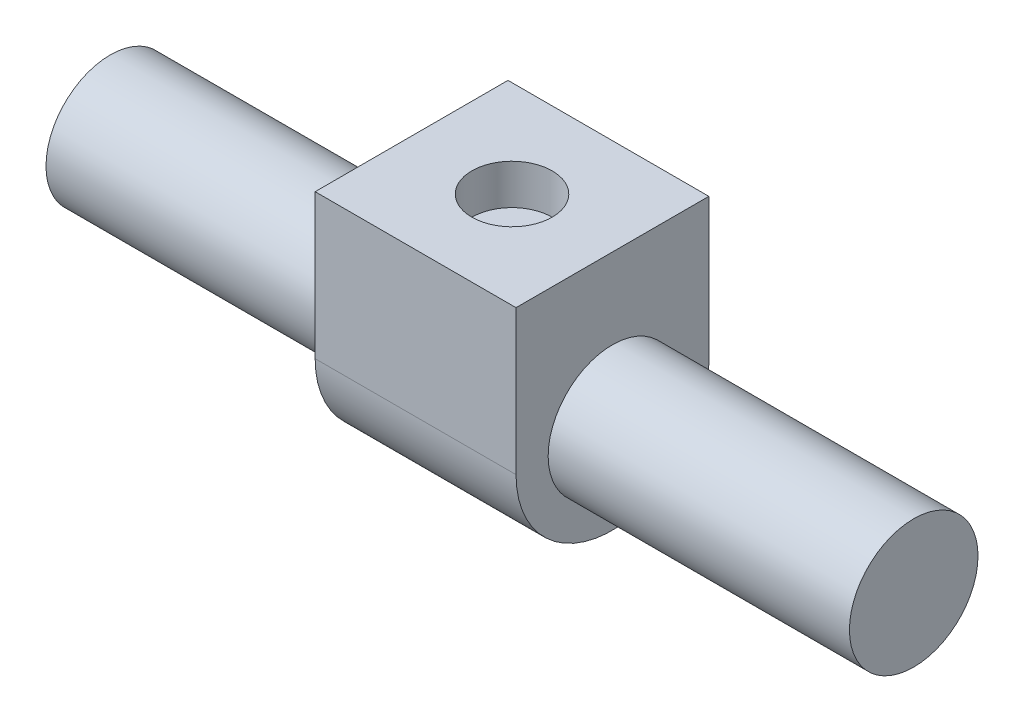
ISO-10303-21;
HEADER;
FILE_DESCRIPTION(('STEP AP214'),'2;1');
FILE_NAME('part.step','',(''),(''),'','','');
FILE_SCHEMA(('AUTOMOTIVE_DESIGN { 1 0 10303 214 1 1 1 1 }'));
ENDSEC;
DATA;
#1=APPLICATION_CONTEXT('core data for automotive mechanical design processes');
#2=APPLICATION_PROTOCOL_DEFINITION('international standard','automotive_design',2000,#1);
#3=PRODUCT_CONTEXT('',#1,'mechanical');
#4=PRODUCT('Part','Part','',(#3));
#5=PRODUCT_RELATED_PRODUCT_CATEGORY('part','',(#4));
#6=PRODUCT_DEFINITION_FORMATION('','',#4);
#7=PRODUCT_DEFINITION_CONTEXT('part definition',#1,'design');
#8=PRODUCT_DEFINITION('design','',#6,#7);
#9=PRODUCT_DEFINITION_SHAPE('','',#8);
#10=(LENGTH_UNIT() NAMED_UNIT(*) SI_UNIT(.MILLI.,.METRE.));
#11=(NAMED_UNIT(*) PLANE_ANGLE_UNIT() SI_UNIT($,.RADIAN.));
#12=(NAMED_UNIT(*) SI_UNIT($,.STERADIAN.) SOLID_ANGLE_UNIT());
#13=UNCERTAINTY_MEASURE_WITH_UNIT(LENGTH_MEASURE(1.E-05),#10,'distance_accuracy_value','');
#14=(GEOMETRIC_REPRESENTATION_CONTEXT(3) GLOBAL_UNCERTAINTY_ASSIGNED_CONTEXT((#13)) GLOBAL_UNIT_ASSIGNED_CONTEXT((#10,
#11,#12)) REPRESENTATION_CONTEXT('',''));
#15=CARTESIAN_POINT('',(0.,0.,0.));
#16=DIRECTION('',(0.,0.,1.));
#17=DIRECTION('',(1.,0.,0.));
#18=AXIS2_PLACEMENT_3D('',#15,#16,#17);
#19=CARTESIAN_POINT('',(12.5,0.,0.));
#20=DIRECTION('',(-1.,0.,0.));
#21=DIRECTION('',(0.,0.,1.));
#22=AXIS2_PLACEMENT_3D('',#19,#20,#21);
#23=CYLINDRICAL_SURFACE('',#22,12.);
#24=CARTESIAN_POINT('',(-12.5,0.,0.));
#25=DIRECTION('',(1.,0.,0.));
#26=DIRECTION('',(0.,0.,1.));
#27=AXIS2_PLACEMENT_3D('',#24,#25,#26);
#28=CIRCLE('',#27,12.);
#29=CARTESIAN_POINT('',(-12.5,0.,12.));
#30=VERTEX_POINT('',#29);
#31=CARTESIAN_POINT('',(-12.5,0.,-12.));
#32=VERTEX_POINT('',#31);
#33=EDGE_CURVE('E109',#30,#32,#28,.T.);
#34=ORIENTED_EDGE('',*,*,#33,.T.);
#35=DIRECTION('',(-1.,0.,0.));
#36=VECTOR('',#35,1.);
#37=CARTESIAN_POINT('',(12.5,0.,-12.));
#38=LINE('',#37,#36);
#39=CARTESIAN_POINT('',(12.5,0.,-12.));
#40=VERTEX_POINT('',#39);
#41=EDGE_CURVE('E50',#40,#32,#38,.T.);
#42=ORIENTED_EDGE('',*,*,#41,.F.);
#43=CARTESIAN_POINT('',(12.5,0.,0.));
#44=DIRECTION('',(1.,0.,0.));
#45=DIRECTION('',(0.,0.,1.));
#46=AXIS2_PLACEMENT_3D('',#43,#44,#45);
#47=CIRCLE('',#46,12.);
#48=CARTESIAN_POINT('',(12.5,0.,12.));
#49=VERTEX_POINT('',#48);
#50=EDGE_CURVE('E95',#49,#40,#47,.T.);
#51=ORIENTED_EDGE('',*,*,#50,.F.);
#52=DIRECTION('',(-1.,0.,0.));
#53=VECTOR('',#52,1.);
#54=CARTESIAN_POINT('',(12.5,0.,12.));
#55=LINE('',#54,#53);
#56=EDGE_CURVE('E105',#49,#30,#55,.T.);
#57=ORIENTED_EDGE('',*,*,#56,.T.);
#58=EDGE_LOOP('',(#34,#42,#51,#57));
#59=FACE_BOUND('',#58,.T.);
#60=ADVANCED_FACE('F41',(#59),#23,.T.);
#61=CARTESIAN_POINT('',(12.5,18.,-12.));
#62=DIRECTION('',(0.,0.,1.));
#63=DIRECTION('',(1.,0.,0.));
#64=AXIS2_PLACEMENT_3D('',#61,#62,#63);
#65=PLANE('',#64);
#66=DIRECTION('',(0.,1.,0.));
#67=VECTOR('',#66,1.);
#68=CARTESIAN_POINT('',(-12.5,18.,-12.));
#69=LINE('',#68,#67);
#70=CARTESIAN_POINT('',(-12.5,18.,-12.));
#71=VERTEX_POINT('',#70);
#72=EDGE_CURVE('E100',#32,#71,#69,.T.);
#73=ORIENTED_EDGE('',*,*,#72,.T.);
#74=DIRECTION('',(-1.,0.,0.));
#75=VECTOR('',#74,1.);
#76=CARTESIAN_POINT('',(12.5,18.,-12.));
#77=LINE('',#76,#75);
#78=CARTESIAN_POINT('',(12.5,18.,-12.));
#79=VERTEX_POINT('',#78);
#80=EDGE_CURVE('E98',#79,#71,#77,.T.);
#81=ORIENTED_EDGE('',*,*,#80,.F.);
#82=DIRECTION('',(0.,1.,0.));
#83=VECTOR('',#82,1.);
#84=CARTESIAN_POINT('',(12.5,18.,-12.));
#85=LINE('',#84,#83);
#86=EDGE_CURVE('E90',#40,#79,#85,.T.);
#87=ORIENTED_EDGE('',*,*,#86,.F.);
#88=ORIENTED_EDGE('',*,*,#41,.T.);
#89=EDGE_LOOP('',(#73,#81,#87,#88));
#90=FACE_BOUND('',#89,.T.);
#91=ADVANCED_FACE('F99',(#90),#65,.F.);
#92=CARTESIAN_POINT('',(12.5,18.,12.));
#93=DIRECTION('',(0.,-1.,0.));
#94=DIRECTION('',(0.,0.,-1.));
#95=AXIS2_PLACEMENT_3D('',#92,#93,#94);
#96=PLANE('',#95);
#97=CARTESIAN_POINT('',(0.,18.,0.));
#98=DIRECTION('',(0.,1.,0.));
#99=DIRECTION('',(0.,0.,1.));
#100=AXIS2_PLACEMENT_3D('',#97,#98,#99);
#101=CIRCLE('',#100,5.);
#102=CARTESIAN_POINT('',(0.,18.,5.));
#103=VERTEX_POINT('',#102);
#104=EDGE_CURVE('E220',#103,#103,#101,.T.);
#105=ORIENTED_EDGE('',*,*,#104,.F.);
#106=EDGE_LOOP('',(#105));
#107=FACE_BOUND('',#106,.T.);
#108=DIRECTION('',(0.,0.,1.));
#109=VECTOR('',#108,1.);
#110=CARTESIAN_POINT('',(-12.5,18.,12.));
#111=LINE('',#110,#109);
#112=CARTESIAN_POINT('',(-12.5,18.,12.));
#113=VERTEX_POINT('',#112);
#114=EDGE_CURVE('E76',#71,#113,#111,.T.);
#115=ORIENTED_EDGE('',*,*,#114,.T.);
#116=DIRECTION('',(-1.,0.,0.));
#117=VECTOR('',#116,1.);
#118=CARTESIAN_POINT('',(12.5,18.,12.));
#119=LINE('',#118,#117);
#120=CARTESIAN_POINT('',(12.5,18.,12.));
#121=VERTEX_POINT('',#120);
#122=EDGE_CURVE('E101',#121,#113,#119,.T.);
#123=ORIENTED_EDGE('',*,*,#122,.F.);
#124=DIRECTION('',(0.,0.,1.));
#125=VECTOR('',#124,1.);
#126=CARTESIAN_POINT('',(12.5,18.,12.));
#127=LINE('',#126,#125);
#128=EDGE_CURVE('E93',#79,#121,#127,.T.);
#129=ORIENTED_EDGE('',*,*,#128,.F.);
#130=ORIENTED_EDGE('',*,*,#80,.T.);
#131=EDGE_LOOP('',(#115,#123,#129,#130));
#132=FACE_BOUND('',#131,.T.);
#133=ADVANCED_FACE('F103',(#107,#132),#96,.F.);
#134=CARTESIAN_POINT('',(12.5,0.,12.));
#135=DIRECTION('',(0.,0.,-1.));
#136=DIRECTION('',(-1.,0.,0.));
#137=AXIS2_PLACEMENT_3D('',#134,#135,#136);
#138=PLANE('',#137);
#139=DIRECTION('',(0.,-1.,0.));
#140=VECTOR('',#139,1.);
#141=CARTESIAN_POINT('',(-12.5,0.,12.));
#142=LINE('',#141,#140);
#143=EDGE_CURVE('E82',#113,#30,#142,.T.);
#144=ORIENTED_EDGE('',*,*,#143,.T.);
#145=ORIENTED_EDGE('',*,*,#56,.F.);
#146=DIRECTION('',(0.,-1.,0.));
#147=VECTOR('',#146,1.);
#148=CARTESIAN_POINT('',(12.5,0.,12.));
#149=LINE('',#148,#147);
#150=EDGE_CURVE('E59',#121,#49,#149,.T.);
#151=ORIENTED_EDGE('',*,*,#150,.F.);
#152=ORIENTED_EDGE('',*,*,#122,.T.);
#153=EDGE_LOOP('',(#144,#145,#151,#152));
#154=FACE_BOUND('',#153,.T.);
#155=ADVANCED_FACE('F131',(#154),#138,.F.);
#156=CARTESIAN_POINT('',(12.5,0.,0.));
#157=DIRECTION('',(-1.,0.,0.));
#158=DIRECTION('',(0.,0.,1.));
#159=AXIS2_PLACEMENT_3D('',#156,#157,#158);
#160=PLANE('',#159);
#161=CARTESIAN_POINT('',(12.5,0.,0.));
#162=DIRECTION('',(-1.,0.,0.));
#163=DIRECTION('',(0.,0.,1.));
#164=AXIS2_PLACEMENT_3D('',#161,#162,#163);
#165=CIRCLE('',#164,8.);
#166=CARTESIAN_POINT('',(12.5,0.,8.));
#167=VERTEX_POINT('',#166);
#168=EDGE_CURVE('E11',#167,#167,#165,.F.);
#169=ORIENTED_EDGE('',*,*,#168,.F.);
#170=EDGE_LOOP('',(#169));
#171=FACE_BOUND('',#170,.T.);
#172=ORIENTED_EDGE('',*,*,#50,.T.);
#173=ORIENTED_EDGE('',*,*,#86,.T.);
#174=ORIENTED_EDGE('',*,*,#128,.T.);
#175=ORIENTED_EDGE('',*,*,#150,.T.);
#176=EDGE_LOOP('',(#172,#173,#174,#175));
#177=FACE_BOUND('',#176,.T.);
#178=ADVANCED_FACE('F91',(#171,#177),#160,.F.);
#179=CARTESIAN_POINT('',(-12.5,0.,0.));
#180=DIRECTION('',(-1.,0.,0.));
#181=DIRECTION('',(0.,0.,1.));
#182=AXIS2_PLACEMENT_3D('',#179,#180,#181);
#183=PLANE('',#182);
#184=CARTESIAN_POINT('',(-12.5,0.,0.));
#185=DIRECTION('',(-1.,0.,0.));
#186=DIRECTION('',(0.,0.,1.));
#187=AXIS2_PLACEMENT_3D('',#184,#185,#186);
#188=CIRCLE('',#187,8.);
#189=CARTESIAN_POINT('',(-12.5,0.,8.));
#190=VERTEX_POINT('',#189);
#191=EDGE_CURVE('E44',#190,#190,#188,.F.);
#192=ORIENTED_EDGE('',*,*,#191,.T.);
#193=EDGE_LOOP('',(#192));
#194=FACE_BOUND('',#193,.T.);
#195=ORIENTED_EDGE('',*,*,#33,.F.);
#196=ORIENTED_EDGE('',*,*,#143,.F.);
#197=ORIENTED_EDGE('',*,*,#114,.F.);
#198=ORIENTED_EDGE('',*,*,#72,.F.);
#199=EDGE_LOOP('',(#195,#196,#197,#198));
#200=FACE_BOUND('',#199,.T.);
#201=ADVANCED_FACE('F119',(#194,#200),#183,.T.);
#202=CARTESIAN_POINT('',(-50.,0.,0.));
#203=DIRECTION('',(1.,0.,0.));
#204=DIRECTION('',(0.,0.,-1.));
#205=AXIS2_PLACEMENT_3D('',#202,#203,#204);
#206=PLANE('',#205);
#207=CARTESIAN_POINT('',(-50.,0.,0.));
#208=DIRECTION('',(1.,0.,0.));
#209=DIRECTION('',(0.,0.,-1.));
#210=AXIS2_PLACEMENT_3D('',#207,#208,#209);
#211=CIRCLE('',#210,8.);
#212=CARTESIAN_POINT('',(-50.,0.,-8.));
#213=VERTEX_POINT('',#212);
#214=EDGE_CURVE('E219',#213,#213,#211,.T.);
#215=ORIENTED_EDGE('',*,*,#214,.F.);
#216=EDGE_LOOP('',(#215));
#217=FACE_BOUND('',#216,.T.);
#218=ADVANCED_FACE('F121',(#217),#206,.F.);
#219=CARTESIAN_POINT('',(50.,0.,0.));
#220=DIRECTION('',(-1.,0.,0.));
#221=DIRECTION('',(0.,0.,1.));
#222=AXIS2_PLACEMENT_3D('',#219,#220,#221);
#223=CYLINDRICAL_SURFACE('',#222,8.);
#224=ORIENTED_EDGE('',*,*,#191,.F.);
#225=EDGE_LOOP('',(#224));
#226=FACE_BOUND('',#225,.T.);
#227=ORIENTED_EDGE('',*,*,#214,.T.);
#228=EDGE_LOOP('',(#227));
#229=FACE_BOUND('',#228,.T.);
#230=ADVANCED_FACE('F128',(#226,#229),#223,.T.);
#231=CARTESIAN_POINT('',(50.,0.,0.));
#232=DIRECTION('',(1.,0.,0.));
#233=DIRECTION('',(0.,0.,-1.));
#234=AXIS2_PLACEMENT_3D('',#231,#232,#233);
#235=CIRCLE('',#234,8.);
#236=CARTESIAN_POINT('',(50.,0.,-8.));
#237=VERTEX_POINT('',#236);
#238=EDGE_CURVE('E223',#237,#237,#235,.T.);
#239=ORIENTED_EDGE('',*,*,#238,.F.);
#240=EDGE_LOOP('',(#239));
#241=FACE_BOUND('',#240,.T.);
#242=ORIENTED_EDGE('',*,*,#168,.T.);
#243=EDGE_LOOP('',(#242));
#244=FACE_BOUND('',#243,.T.);
#245=ADVANCED_FACE('F174',(#241,#244),#223,.T.);
#246=CARTESIAN_POINT('',(50.,0.,0.));
#247=DIRECTION('',(1.,0.,0.));
#248=DIRECTION('',(0.,0.,-1.));
#249=AXIS2_PLACEMENT_3D('',#246,#247,#248);
#250=PLANE('',#249);
#251=ORIENTED_EDGE('',*,*,#238,.T.);
#252=EDGE_LOOP('',(#251));
#253=FACE_BOUND('',#252,.T.);
#254=ADVANCED_FACE('F184',(#253),#250,.T.);
#255=CARTESIAN_POINT('',(0.,13.,0.));
#256=DIRECTION('',(0.,1.,0.));
#257=DIRECTION('',(0.,0.,1.));
#258=AXIS2_PLACEMENT_3D('',#255,#256,#257);
#259=CYLINDRICAL_SURFACE('',#258,5.);
#260=CARTESIAN_POINT('',(0.,13.,0.));
#261=DIRECTION('',(0.,1.,0.));
#262=DIRECTION('',(0.,0.,1.));
#263=AXIS2_PLACEMENT_3D('',#260,#261,#262);
#264=CIRCLE('',#263,5.);
#265=CARTESIAN_POINT('',(0.,13.,5.));
#266=VERTEX_POINT('',#265);
#267=EDGE_CURVE('E218',#266,#266,#264,.T.);
#268=ORIENTED_EDGE('',*,*,#267,.F.);
#269=EDGE_LOOP('',(#268));
#270=FACE_BOUND('',#269,.T.);
#271=ORIENTED_EDGE('',*,*,#104,.T.);
#272=EDGE_LOOP('',(#271));
#273=FACE_BOUND('',#272,.T.);
#274=ADVANCED_FACE('F193',(#270,#273),#259,.F.);
#275=CARTESIAN_POINT('',(0.,13.,0.));
#276=DIRECTION('',(0.,1.,0.));
#277=DIRECTION('',(0.,0.,1.));
#278=AXIS2_PLACEMENT_3D('',#275,#276,#277);
#279=PLANE('',#278);
#280=ORIENTED_EDGE('',*,*,#267,.T.);
#281=EDGE_LOOP('',(#280));
#282=FACE_BOUND('',#281,.T.);
#283=ADVANCED_FACE('F203',(#282),#279,.T.);
#284=CLOSED_SHELL('',(#60,#91,#133,#155,#178,#201,#218,#230,#245,#254,#274,#283));
#285=MANIFOLD_SOLID_BREP('B2',#284);
#286=ADVANCED_BREP_SHAPE_REPRESENTATION('',(#18,#285),#14);
#287=SHAPE_DEFINITION_REPRESENTATION(#9,#286);
ENDSEC;
END-ISO-10303-21;
